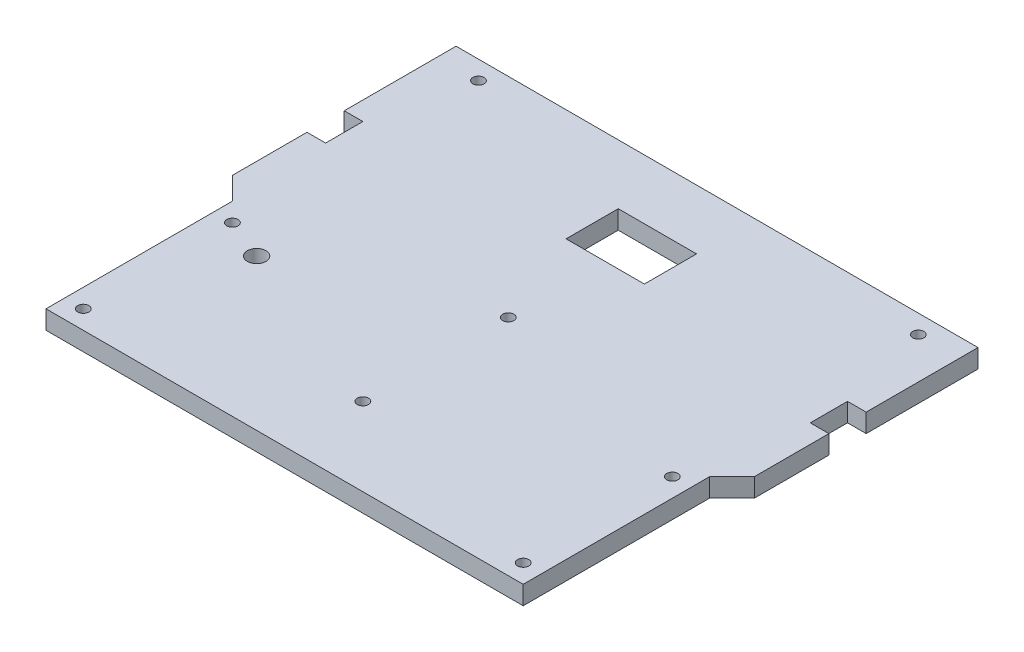
ISO-10303-21;
HEADER;
FILE_DESCRIPTION(('STEP AP214'),'2;1');
FILE_NAME('part.step','',(''),(''),'','','');
FILE_SCHEMA(('AUTOMOTIVE_DESIGN { 1 0 10303 214 1 1 1 1 }'));
ENDSEC;
DATA;
#1=APPLICATION_CONTEXT('core data for automotive mechanical design processes');
#2=APPLICATION_PROTOCOL_DEFINITION('international standard','automotive_design',2000,#1);
#3=PRODUCT_CONTEXT('',#1,'mechanical');
#4=PRODUCT('Part','Part','',(#3));
#5=PRODUCT_RELATED_PRODUCT_CATEGORY('part','',(#4));
#6=PRODUCT_DEFINITION_FORMATION('','',#4);
#7=PRODUCT_DEFINITION_CONTEXT('part definition',#1,'design');
#8=PRODUCT_DEFINITION('design','',#6,#7);
#9=PRODUCT_DEFINITION_SHAPE('','',#8);
#10=(LENGTH_UNIT() NAMED_UNIT(*) SI_UNIT(.MILLI.,.METRE.));
#11=(NAMED_UNIT(*) PLANE_ANGLE_UNIT() SI_UNIT($,.RADIAN.));
#12=(NAMED_UNIT(*) SI_UNIT($,.STERADIAN.) SOLID_ANGLE_UNIT());
#13=UNCERTAINTY_MEASURE_WITH_UNIT(LENGTH_MEASURE(1.E-05),#10,'distance_accuracy_value','');
#14=(GEOMETRIC_REPRESENTATION_CONTEXT(3) GLOBAL_UNCERTAINTY_ASSIGNED_CONTEXT((#13)) GLOBAL_UNIT_ASSIGNED_CONTEXT((#10,
#11,#12)) REPRESENTATION_CONTEXT('',''));
#15=CARTESIAN_POINT('',(0.,0.,0.));
#16=DIRECTION('',(0.,0.,1.));
#17=DIRECTION('',(1.,0.,0.));
#18=AXIS2_PLACEMENT_3D('',#15,#16,#17);
#19=CARTESIAN_POINT('',(0.,5.,0.));
#20=DIRECTION('',(0.,1.,0.));
#21=DIRECTION('',(0.,0.,1.));
#22=AXIS2_PLACEMENT_3D('',#19,#20,#21);
#23=PLANE('',#22);
#24=DIRECTION('',(-1.,0.,0.));
#25=VECTOR('',#24,1.);
#26=CARTESIAN_POINT('',(0.,5.,16.));
#27=LINE('',#26,#25);
#28=CARTESIAN_POINT('',(10.5,5.,16.));
#29=VERTEX_POINT('',#28);
#30=CARTESIAN_POINT('',(-10.5,5.,16.));
#31=VERTEX_POINT('',#30);
#32=EDGE_CURVE('E55',#29,#31,#27,.T.);
#33=ORIENTED_EDGE('',*,*,#32,.F.);
#34=DIRECTION('',(0.,0.,1.));
#35=VECTOR('',#34,1.);
#36=CARTESIAN_POINT('',(10.5,5.,0.));
#37=LINE('',#36,#35);
#38=CARTESIAN_POINT('',(10.5,5.,30.));
#39=VERTEX_POINT('',#38);
#40=EDGE_CURVE('E196',#29,#39,#37,.T.);
#41=ORIENTED_EDGE('',*,*,#40,.T.);
#42=DIRECTION('',(-1.,0.,0.));
#43=VECTOR('',#42,1.);
#44=CARTESIAN_POINT('',(0.,5.,30.));
#45=LINE('',#44,#43);
#46=CARTESIAN_POINT('',(-10.5,5.,30.));
#47=VERTEX_POINT('',#46);
#48=EDGE_CURVE('E200',#39,#47,#45,.T.);
#49=ORIENTED_EDGE('',*,*,#48,.T.);
#50=DIRECTION('',(0.,0.,1.));
#51=VECTOR('',#50,1.);
#52=CARTESIAN_POINT('',(-10.5,5.,0.));
#53=LINE('',#52,#51);
#54=EDGE_CURVE('E209',#31,#47,#53,.T.);
#55=ORIENTED_EDGE('',*,*,#54,.F.);
#56=EDGE_LOOP('',(#33,#41,#49,#55));
#57=FACE_BOUND('',#56,.T.);
#58=CARTESIAN_POINT('',(0.,5.,56.));
#59=DIRECTION('',(0.,1.,0.));
#60=DIRECTION('',(0.,0.,1.));
#61=AXIS2_PLACEMENT_3D('',#58,#59,#60);
#62=CIRCLE('',#61,1.5);
#63=CARTESIAN_POINT('',(0.,5.,57.5));
#64=VERTEX_POINT('',#63);
#65=EDGE_CURVE('E210',#64,#64,#62,.T.);
#66=ORIENTED_EDGE('',*,*,#65,.F.);
#67=EDGE_LOOP('',(#66));
#68=FACE_BOUND('',#67,.T.);
#69=CARTESIAN_POINT('',(0.,5.,95.));
#70=DIRECTION('',(0.,1.,0.));
#71=DIRECTION('',(0.,0.,1.));
#72=AXIS2_PLACEMENT_3D('',#69,#70,#71);
#73=CIRCLE('',#72,1.5);
#74=CARTESIAN_POINT('',(0.,5.,96.5));
#75=VERTEX_POINT('',#74);
#76=EDGE_CURVE('E232',#75,#75,#73,.T.);
#77=ORIENTED_EDGE('',*,*,#76,.F.);
#78=EDGE_LOOP('',(#77));
#79=FACE_BOUND('',#78,.T.);
#80=CARTESIAN_POINT('',(-48.,5.,75.5));
#81=DIRECTION('',(0.,1.,0.));
#82=DIRECTION('',(0.,0.,1.));
#83=AXIS2_PLACEMENT_3D('',#80,#81,#82);
#84=CIRCLE('',#83,2.5);
#85=CARTESIAN_POINT('',(-48.,5.,78.));
#86=VERTEX_POINT('',#85);
#87=EDGE_CURVE('E240',#86,#86,#84,.T.);
#88=ORIENTED_EDGE('',*,*,#87,.F.);
#89=EDGE_LOOP('',(#88));
#90=FACE_BOUND('',#89,.T.);
#91=CARTESIAN_POINT('',(-59.,5.,71.));
#92=DIRECTION('',(0.,1.,0.));
#93=DIRECTION('',(0.,0.,-1.));
#94=AXIS2_PLACEMENT_3D('',#91,#92,#93);
#95=CIRCLE('',#94,1.5);
#96=CARTESIAN_POINT('',(-59.,5.,69.5));
#97=VERTEX_POINT('',#96);
#98=EDGE_CURVE('E256',#97,#97,#95,.T.);
#99=ORIENTED_EDGE('',*,*,#98,.F.);
#100=EDGE_LOOP('',(#99));
#101=FACE_BOUND('',#100,.T.);
#102=CARTESIAN_POINT('',(59.,5.,5.));
#103=DIRECTION('',(0.,1.,0.));
#104=DIRECTION('',(0.,0.,1.));
#105=AXIS2_PLACEMENT_3D('',#102,#103,#104);
#106=CIRCLE('',#105,1.5);
#107=CARTESIAN_POINT('',(59.,5.,6.50000000000001));
#108=VERTEX_POINT('',#107);
#109=EDGE_CURVE('E272',#108,#108,#106,.T.);
#110=ORIENTED_EDGE('',*,*,#109,.F.);
#111=EDGE_LOOP('',(#110));
#112=FACE_BOUND('',#111,.T.);
#113=CARTESIAN_POINT('',(59.,5.,71.));
#114=DIRECTION('',(0.,1.,0.));
#115=DIRECTION('',(0.,0.,1.));
#116=AXIS2_PLACEMENT_3D('',#113,#114,#115);
#117=CIRCLE('',#116,1.5);
#118=CARTESIAN_POINT('',(59.,5.,72.5));
#119=VERTEX_POINT('',#118);
#120=EDGE_CURVE('E288',#119,#119,#117,.T.);
#121=ORIENTED_EDGE('',*,*,#120,.F.);
#122=EDGE_LOOP('',(#121));
#123=FACE_BOUND('',#122,.T.);
#124=DIRECTION('',(1.,0.,0.));
#125=VECTOR('',#124,1.);
#126=CARTESIAN_POINT('',(-64.,5.,116.));
#127=LINE('',#126,#125);
#128=CARTESIAN_POINT('',(-64.,5.,116.));
#129=VERTEX_POINT('',#128);
#130=CARTESIAN_POINT('',(64.,5.,116.));
#131=VERTEX_POINT('',#130);
#132=EDGE_CURVE('E296',#129,#131,#127,.T.);
#133=ORIENTED_EDGE('',*,*,#132,.T.);
#134=DIRECTION('',(0.,0.,-1.));
#135=VECTOR('',#134,1.);
#136=CARTESIAN_POINT('',(64.,5.,116.));
#137=LINE('',#136,#135);
#138=CARTESIAN_POINT('',(64.,5.,66.));
#139=VERTEX_POINT('',#138);
#140=EDGE_CURVE('E300',#131,#139,#137,.T.);
#141=ORIENTED_EDGE('',*,*,#140,.T.);
#142=DIRECTION('',(0.707106781186548,0.,-0.707106781186547));
#143=VECTOR('',#142,1.);
#144=CARTESIAN_POINT('',(64.,5.,66.));
#145=LINE('',#144,#143);
#146=CARTESIAN_POINT('',(70.,5.,60.));
#147=VERTEX_POINT('',#146);
#148=EDGE_CURVE('E304',#139,#147,#145,.T.);
#149=ORIENTED_EDGE('',*,*,#148,.T.);
#150=DIRECTION('',(0.,0.,-1.));
#151=VECTOR('',#150,1.);
#152=CARTESIAN_POINT('',(70.,5.,60.));
#153=LINE('',#152,#151);
#154=CARTESIAN_POINT('',(70.,5.,40.));
#155=VERTEX_POINT('',#154);
#156=EDGE_CURVE('E307',#147,#155,#153,.T.);
#157=ORIENTED_EDGE('',*,*,#156,.T.);
#158=DIRECTION('',(-1.,0.,0.));
#159=VECTOR('',#158,1.);
#160=CARTESIAN_POINT('',(70.,5.,40.));
#161=LINE('',#160,#159);
#162=CARTESIAN_POINT('',(65.,5.,40.));
#163=VERTEX_POINT('',#162);
#164=EDGE_CURVE('E310',#155,#163,#161,.T.);
#165=ORIENTED_EDGE('',*,*,#164,.T.);
#166=DIRECTION('',(0.,0.,-1.));
#167=VECTOR('',#166,1.);
#168=CARTESIAN_POINT('',(65.,5.,40.));
#169=LINE('',#168,#167);
#170=CARTESIAN_POINT('',(65.,5.,30.));
#171=VERTEX_POINT('',#170);
#172=EDGE_CURVE('E313',#163,#171,#169,.T.);
#173=ORIENTED_EDGE('',*,*,#172,.T.);
#174=DIRECTION('',(1.,0.,0.));
#175=VECTOR('',#174,1.);
#176=CARTESIAN_POINT('',(65.,5.,30.));
#177=LINE('',#176,#175);
#178=CARTESIAN_POINT('',(70.,5.,30.));
#179=VERTEX_POINT('',#178);
#180=EDGE_CURVE('E316',#171,#179,#177,.T.);
#181=ORIENTED_EDGE('',*,*,#180,.T.);
#182=DIRECTION('',(0.,0.,-1.));
#183=VECTOR('',#182,1.);
#184=CARTESIAN_POINT('',(70.,5.,30.));
#185=LINE('',#184,#183);
#186=CARTESIAN_POINT('',(70.,5.,0.));
#187=VERTEX_POINT('',#186);
#188=EDGE_CURVE('E319',#179,#187,#185,.T.);
#189=ORIENTED_EDGE('',*,*,#188,.T.);
#190=DIRECTION('',(-1.,0.,0.));
#191=VECTOR('',#190,1.);
#192=CARTESIAN_POINT('',(70.,5.,0.));
#193=LINE('',#192,#191);
#194=CARTESIAN_POINT('',(-70.,5.,0.));
#195=VERTEX_POINT('',#194);
#196=EDGE_CURVE('E322',#187,#195,#193,.T.);
#197=ORIENTED_EDGE('',*,*,#196,.T.);
#198=DIRECTION('',(0.,0.,1.));
#199=VECTOR('',#198,1.);
#200=CARTESIAN_POINT('',(-70.,5.,30.));
#201=LINE('',#200,#199);
#202=CARTESIAN_POINT('',(-70.,5.,30.));
#203=VERTEX_POINT('',#202);
#204=EDGE_CURVE('E325',#195,#203,#201,.T.);
#205=ORIENTED_EDGE('',*,*,#204,.T.);
#206=DIRECTION('',(1.,0.,0.));
#207=VECTOR('',#206,1.);
#208=CARTESIAN_POINT('',(-65.,5.,30.));
#209=LINE('',#208,#207);
#210=CARTESIAN_POINT('',(-65.,5.,30.));
#211=VERTEX_POINT('',#210);
#212=EDGE_CURVE('E328',#203,#211,#209,.T.);
#213=ORIENTED_EDGE('',*,*,#212,.T.);
#214=DIRECTION('',(0.,0.,1.));
#215=VECTOR('',#214,1.);
#216=CARTESIAN_POINT('',(-65.,5.,40.));
#217=LINE('',#216,#215);
#218=CARTESIAN_POINT('',(-65.,5.,40.));
#219=VERTEX_POINT('',#218);
#220=EDGE_CURVE('E331',#211,#219,#217,.T.);
#221=ORIENTED_EDGE('',*,*,#220,.T.);
#222=DIRECTION('',(-1.,0.,0.));
#223=VECTOR('',#222,1.);
#224=CARTESIAN_POINT('',(-70.,5.,40.));
#225=LINE('',#224,#223);
#226=CARTESIAN_POINT('',(-70.,5.,40.));
#227=VERTEX_POINT('',#226);
#228=EDGE_CURVE('E334',#219,#227,#225,.T.);
#229=ORIENTED_EDGE('',*,*,#228,.T.);
#230=DIRECTION('',(0.,0.,1.));
#231=VECTOR('',#230,1.);
#232=CARTESIAN_POINT('',(-70.,5.,60.));
#233=LINE('',#232,#231);
#234=CARTESIAN_POINT('',(-70.,5.,60.));
#235=VERTEX_POINT('',#234);
#236=EDGE_CURVE('E337',#227,#235,#233,.T.);
#237=ORIENTED_EDGE('',*,*,#236,.T.);
#238=DIRECTION('',(0.707106781186547,0.,0.707106781186547));
#239=VECTOR('',#238,1.);
#240=CARTESIAN_POINT('',(-64.,5.,66.));
#241=LINE('',#240,#239);
#242=CARTESIAN_POINT('',(-64.,5.,66.));
#243=VERTEX_POINT('',#242);
#244=EDGE_CURVE('E340',#235,#243,#241,.T.);
#245=ORIENTED_EDGE('',*,*,#244,.T.);
#246=DIRECTION('',(0.,0.,1.));
#247=VECTOR('',#246,1.);
#248=CARTESIAN_POINT('',(-64.,5.,116.));
#249=LINE('',#248,#247);
#250=EDGE_CURVE('E343',#243,#129,#249,.T.);
#251=ORIENTED_EDGE('',*,*,#250,.T.);
#252=EDGE_LOOP('',(#133,#141,#149,#157,#165,#173,#181,#189,#197,#205,#213,#221,#229,#237,#245,#251));
#253=FACE_BOUND('',#252,.T.);
#254=CARTESIAN_POINT('',(59.,5.,111.));
#255=DIRECTION('',(0.,1.,0.));
#256=DIRECTION('',(0.,0.,1.));
#257=AXIS2_PLACEMENT_3D('',#254,#255,#256);
#258=CIRCLE('',#257,1.5);
#259=CARTESIAN_POINT('',(59.,5.,112.5));
#260=VERTEX_POINT('',#259);
#261=EDGE_CURVE('E280',#260,#260,#258,.T.);
#262=ORIENTED_EDGE('',*,*,#261,.F.);
#263=EDGE_LOOP('',(#262));
#264=FACE_BOUND('',#263,.T.);
#265=CARTESIAN_POINT('',(-59.,5.,111.));
#266=DIRECTION('',(0.,1.,0.));
#267=DIRECTION('',(0.,0.,-1.));
#268=AXIS2_PLACEMENT_3D('',#265,#266,#267);
#269=CIRCLE('',#268,1.5);
#270=CARTESIAN_POINT('',(-59.,5.,109.5));
#271=VERTEX_POINT('',#270);
#272=EDGE_CURVE('E264',#271,#271,#269,.T.);
#273=ORIENTED_EDGE('',*,*,#272,.F.);
#274=EDGE_LOOP('',(#273));
#275=FACE_BOUND('',#274,.T.);
#276=CARTESIAN_POINT('',(-59.,5.,5.00000000000002));
#277=DIRECTION('',(0.,1.,0.));
#278=DIRECTION('',(0.,0.,-1.));
#279=AXIS2_PLACEMENT_3D('',#276,#277,#278);
#280=CIRCLE('',#279,1.5);
#281=CARTESIAN_POINT('',(-59.,5.,3.50000000000001));
#282=VERTEX_POINT('',#281);
#283=EDGE_CURVE('E248',#282,#282,#280,.T.);
#284=ORIENTED_EDGE('',*,*,#283,.F.);
#285=EDGE_LOOP('',(#284));
#286=FACE_BOUND('',#285,.T.);
#287=ADVANCED_FACE('F39',(#57,#68,#79,#90,#101,#112,#123,#253,#264,#275,#286),#23,.T.);
#288=CARTESIAN_POINT('',(0.,0.,0.));
#289=DIRECTION('',(0.,1.,0.));
#290=DIRECTION('',(0.,0.,1.));
#291=AXIS2_PLACEMENT_3D('',#288,#289,#290);
#292=PLANE('',#291);
#293=DIRECTION('',(0.,0.,1.));
#294=VECTOR('',#293,1.);
#295=CARTESIAN_POINT('',(10.5,0.,0.));
#296=LINE('',#295,#294);
#297=CARTESIAN_POINT('',(10.5,0.,16.));
#298=VERTEX_POINT('',#297);
#299=CARTESIAN_POINT('',(10.5,0.,30.));
#300=VERTEX_POINT('',#299);
#301=EDGE_CURVE('E183',#298,#300,#296,.T.);
#302=ORIENTED_EDGE('',*,*,#301,.F.);
#303=DIRECTION('',(-1.,0.,0.));
#304=VECTOR('',#303,1.);
#305=CARTESIAN_POINT('',(0.,0.,16.));
#306=LINE('',#305,#304);
#307=CARTESIAN_POINT('',(-10.5,0.,16.));
#308=VERTEX_POINT('',#307);
#309=EDGE_CURVE('E179',#298,#308,#306,.T.);
#310=ORIENTED_EDGE('',*,*,#309,.T.);
#311=DIRECTION('',(0.,0.,1.));
#312=VECTOR('',#311,1.);
#313=CARTESIAN_POINT('',(-10.5,0.,0.));
#314=LINE('',#313,#312);
#315=CARTESIAN_POINT('',(-10.5,0.,30.));
#316=VERTEX_POINT('',#315);
#317=EDGE_CURVE('E186',#308,#316,#314,.T.);
#318=ORIENTED_EDGE('',*,*,#317,.T.);
#319=DIRECTION('',(-1.,0.,0.));
#320=VECTOR('',#319,1.);
#321=CARTESIAN_POINT('',(0.,0.,30.));
#322=LINE('',#321,#320);
#323=EDGE_CURVE('E191',#300,#316,#322,.T.);
#324=ORIENTED_EDGE('',*,*,#323,.F.);
#325=EDGE_LOOP('',(#302,#310,#318,#324));
#326=FACE_BOUND('',#325,.T.);
#327=CARTESIAN_POINT('',(0.,0.,56.));
#328=DIRECTION('',(0.,1.,0.));
#329=DIRECTION('',(0.,0.,1.));
#330=AXIS2_PLACEMENT_3D('',#327,#328,#329);
#331=CIRCLE('',#330,1.5);
#332=CARTESIAN_POINT('',(0.,0.,57.5));
#333=VERTEX_POINT('',#332);
#334=EDGE_CURVE('E228',#333,#333,#331,.T.);
#335=ORIENTED_EDGE('',*,*,#334,.T.);
#336=EDGE_LOOP('',(#335));
#337=FACE_BOUND('',#336,.T.);
#338=CARTESIAN_POINT('',(0.,0.,95.));
#339=DIRECTION('',(0.,1.,0.));
#340=DIRECTION('',(0.,0.,1.));
#341=AXIS2_PLACEMENT_3D('',#338,#339,#340);
#342=CIRCLE('',#341,1.5);
#343=CARTESIAN_POINT('',(0.,0.,96.5));
#344=VERTEX_POINT('',#343);
#345=EDGE_CURVE('E236',#344,#344,#342,.T.);
#346=ORIENTED_EDGE('',*,*,#345,.T.);
#347=EDGE_LOOP('',(#346));
#348=FACE_BOUND('',#347,.T.);
#349=CARTESIAN_POINT('',(-48.,0.,75.5));
#350=DIRECTION('',(0.,1.,0.));
#351=DIRECTION('',(0.,0.,1.));
#352=AXIS2_PLACEMENT_3D('',#349,#350,#351);
#353=CIRCLE('',#352,2.5);
#354=CARTESIAN_POINT('',(-48.,0.,78.));
#355=VERTEX_POINT('',#354);
#356=EDGE_CURVE('E244',#355,#355,#353,.T.);
#357=ORIENTED_EDGE('',*,*,#356,.T.);
#358=EDGE_LOOP('',(#357));
#359=FACE_BOUND('',#358,.T.);
#360=DIRECTION('',(1.,0.,0.));
#361=VECTOR('',#360,1.);
#362=CARTESIAN_POINT('',(-64.,0.,116.));
#363=LINE('',#362,#361);
#364=CARTESIAN_POINT('',(-64.,0.,116.));
#365=VERTEX_POINT('',#364);
#366=CARTESIAN_POINT('',(64.,0.,116.));
#367=VERTEX_POINT('',#366);
#368=EDGE_CURVE('E292',#365,#367,#363,.T.);
#369=ORIENTED_EDGE('',*,*,#368,.F.);
#370=DIRECTION('',(0.,0.,1.));
#371=VECTOR('',#370,1.);
#372=CARTESIAN_POINT('',(-64.,0.,116.));
#373=LINE('',#372,#371);
#374=CARTESIAN_POINT('',(-64.,0.,66.));
#375=VERTEX_POINT('',#374);
#376=EDGE_CURVE('E301',#375,#365,#373,.T.);
#377=ORIENTED_EDGE('',*,*,#376,.F.);
#378=DIRECTION('',(0.707106781186547,0.,0.707106781186547));
#379=VECTOR('',#378,1.);
#380=CARTESIAN_POINT('',(-64.,0.,66.));
#381=LINE('',#380,#379);
#382=CARTESIAN_POINT('',(-70.,0.,60.));
#383=VERTEX_POINT('',#382);
#384=EDGE_CURVE('E389',#383,#375,#381,.T.);
#385=ORIENTED_EDGE('',*,*,#384,.F.);
#386=DIRECTION('',(0.,0.,1.));
#387=VECTOR('',#386,1.);
#388=CARTESIAN_POINT('',(-70.,0.,60.));
#389=LINE('',#388,#387);
#390=CARTESIAN_POINT('',(-70.,0.,40.));
#391=VERTEX_POINT('',#390);
#392=EDGE_CURVE('E386',#391,#383,#389,.T.);
#393=ORIENTED_EDGE('',*,*,#392,.F.);
#394=DIRECTION('',(-1.,0.,0.));
#395=VECTOR('',#394,1.);
#396=CARTESIAN_POINT('',(-70.,0.,40.));
#397=LINE('',#396,#395);
#398=CARTESIAN_POINT('',(-65.,0.,40.));
#399=VERTEX_POINT('',#398);
#400=EDGE_CURVE('E383',#399,#391,#397,.T.);
#401=ORIENTED_EDGE('',*,*,#400,.F.);
#402=DIRECTION('',(0.,0.,1.));
#403=VECTOR('',#402,1.);
#404=CARTESIAN_POINT('',(-65.,0.,40.));
#405=LINE('',#404,#403);
#406=CARTESIAN_POINT('',(-65.,0.,30.));
#407=VERTEX_POINT('',#406);
#408=EDGE_CURVE('E380',#407,#399,#405,.T.);
#409=ORIENTED_EDGE('',*,*,#408,.F.);
#410=DIRECTION('',(1.,0.,0.));
#411=VECTOR('',#410,1.);
#412=CARTESIAN_POINT('',(-65.,0.,30.));
#413=LINE('',#412,#411);
#414=CARTESIAN_POINT('',(-70.,0.,30.));
#415=VERTEX_POINT('',#414);
#416=EDGE_CURVE('E377',#415,#407,#413,.T.);
#417=ORIENTED_EDGE('',*,*,#416,.F.);
#418=DIRECTION('',(0.,0.,1.));
#419=VECTOR('',#418,1.);
#420=CARTESIAN_POINT('',(-70.,0.,30.));
#421=LINE('',#420,#419);
#422=CARTESIAN_POINT('',(-70.,0.,0.));
#423=VERTEX_POINT('',#422);
#424=EDGE_CURVE('E374',#423,#415,#421,.T.);
#425=ORIENTED_EDGE('',*,*,#424,.F.);
#426=DIRECTION('',(-1.,0.,0.));
#427=VECTOR('',#426,1.);
#428=CARTESIAN_POINT('',(70.,0.,0.));
#429=LINE('',#428,#427);
#430=CARTESIAN_POINT('',(70.,0.,0.));
#431=VERTEX_POINT('',#430);
#432=EDGE_CURVE('E371',#431,#423,#429,.T.);
#433=ORIENTED_EDGE('',*,*,#432,.F.);
#434=DIRECTION('',(0.,0.,-1.));
#435=VECTOR('',#434,1.);
#436=CARTESIAN_POINT('',(70.,0.,30.));
#437=LINE('',#436,#435);
#438=CARTESIAN_POINT('',(70.,0.,30.));
#439=VERTEX_POINT('',#438);
#440=EDGE_CURVE('E368',#439,#431,#437,.T.);
#441=ORIENTED_EDGE('',*,*,#440,.F.);
#442=DIRECTION('',(1.,0.,0.));
#443=VECTOR('',#442,1.);
#444=CARTESIAN_POINT('',(65.,0.,30.));
#445=LINE('',#444,#443);
#446=CARTESIAN_POINT('',(65.,0.,30.));
#447=VERTEX_POINT('',#446);
#448=EDGE_CURVE('E365',#447,#439,#445,.T.);
#449=ORIENTED_EDGE('',*,*,#448,.F.);
#450=DIRECTION('',(0.,0.,-1.));
#451=VECTOR('',#450,1.);
#452=CARTESIAN_POINT('',(65.,0.,40.));
#453=LINE('',#452,#451);
#454=CARTESIAN_POINT('',(65.,0.,40.));
#455=VERTEX_POINT('',#454);
#456=EDGE_CURVE('E362',#455,#447,#453,.T.);
#457=ORIENTED_EDGE('',*,*,#456,.F.);
#458=DIRECTION('',(-1.,0.,0.));
#459=VECTOR('',#458,1.);
#460=CARTESIAN_POINT('',(70.,0.,40.));
#461=LINE('',#460,#459);
#462=CARTESIAN_POINT('',(70.,0.,40.));
#463=VERTEX_POINT('',#462);
#464=EDGE_CURVE('E359',#463,#455,#461,.T.);
#465=ORIENTED_EDGE('',*,*,#464,.F.);
#466=DIRECTION('',(0.,0.,-1.));
#467=VECTOR('',#466,1.);
#468=CARTESIAN_POINT('',(70.,0.,60.));
#469=LINE('',#468,#467);
#470=CARTESIAN_POINT('',(70.,0.,60.));
#471=VERTEX_POINT('',#470);
#472=EDGE_CURVE('E356',#471,#463,#469,.T.);
#473=ORIENTED_EDGE('',*,*,#472,.F.);
#474=DIRECTION('',(0.707106781186548,0.,-0.707106781186547));
#475=VECTOR('',#474,1.);
#476=CARTESIAN_POINT('',(64.,0.,66.));
#477=LINE('',#476,#475);
#478=CARTESIAN_POINT('',(64.,0.,66.));
#479=VERTEX_POINT('',#478);
#480=EDGE_CURVE('E353',#479,#471,#477,.T.);
#481=ORIENTED_EDGE('',*,*,#480,.F.);
#482=DIRECTION('',(0.,0.,-1.));
#483=VECTOR('',#482,1.);
#484=CARTESIAN_POINT('',(64.,0.,116.));
#485=LINE('',#484,#483);
#486=EDGE_CURVE('E350',#367,#479,#485,.T.);
#487=ORIENTED_EDGE('',*,*,#486,.F.);
#488=EDGE_LOOP('',(#369,#377,#385,#393,#401,#409,#417,#425,#433,#441,#449,#457,#465,#473,#481,#487));
#489=FACE_BOUND('',#488,.T.);
#490=CARTESIAN_POINT('',(59.,0.,71.));
#491=DIRECTION('',(0.,1.,0.));
#492=DIRECTION('',(0.,0.,1.));
#493=AXIS2_PLACEMENT_3D('',#490,#491,#492);
#494=CIRCLE('',#493,1.5);
#495=CARTESIAN_POINT('',(59.,0.,72.5));
#496=VERTEX_POINT('',#495);
#497=EDGE_CURVE('E284',#496,#496,#494,.T.);
#498=ORIENTED_EDGE('',*,*,#497,.T.);
#499=EDGE_LOOP('',(#498));
#500=FACE_BOUND('',#499,.T.);
#501=CARTESIAN_POINT('',(59.,0.,111.));
#502=DIRECTION('',(0.,1.,0.));
#503=DIRECTION('',(0.,0.,1.));
#504=AXIS2_PLACEMENT_3D('',#501,#502,#503);
#505=CIRCLE('',#504,1.5);
#506=CARTESIAN_POINT('',(59.,0.,112.5));
#507=VERTEX_POINT('',#506);
#508=EDGE_CURVE('E276',#507,#507,#505,.T.);
#509=ORIENTED_EDGE('',*,*,#508,.T.);
#510=EDGE_LOOP('',(#509));
#511=FACE_BOUND('',#510,.T.);
#512=CARTESIAN_POINT('',(59.,0.,5.));
#513=DIRECTION('',(0.,1.,0.));
#514=DIRECTION('',(0.,0.,1.));
#515=AXIS2_PLACEMENT_3D('',#512,#513,#514);
#516=CIRCLE('',#515,1.5);
#517=CARTESIAN_POINT('',(59.,0.,6.50000000000001));
#518=VERTEX_POINT('',#517);
#519=EDGE_CURVE('E268',#518,#518,#516,.T.);
#520=ORIENTED_EDGE('',*,*,#519,.T.);
#521=EDGE_LOOP('',(#520));
#522=FACE_BOUND('',#521,.T.);
#523=CARTESIAN_POINT('',(-59.,0.,111.));
#524=DIRECTION('',(0.,1.,0.));
#525=DIRECTION('',(0.,0.,-1.));
#526=AXIS2_PLACEMENT_3D('',#523,#524,#525);
#527=CIRCLE('',#526,1.5);
#528=CARTESIAN_POINT('',(-59.,0.,109.5));
#529=VERTEX_POINT('',#528);
#530=EDGE_CURVE('E260',#529,#529,#527,.T.);
#531=ORIENTED_EDGE('',*,*,#530,.T.);
#532=EDGE_LOOP('',(#531));
#533=FACE_BOUND('',#532,.T.);
#534=CARTESIAN_POINT('',(-59.,0.,71.));
#535=DIRECTION('',(0.,1.,0.));
#536=DIRECTION('',(0.,0.,-1.));
#537=AXIS2_PLACEMENT_3D('',#534,#535,#536);
#538=CIRCLE('',#537,1.5);
#539=CARTESIAN_POINT('',(-59.,0.,69.5));
#540=VERTEX_POINT('',#539);
#541=EDGE_CURVE('E252',#540,#540,#538,.T.);
#542=ORIENTED_EDGE('',*,*,#541,.T.);
#543=EDGE_LOOP('',(#542));
#544=FACE_BOUND('',#543,.T.);
#545=CARTESIAN_POINT('',(-59.,0.,5.00000000000002));
#546=DIRECTION('',(0.,1.,0.));
#547=DIRECTION('',(0.,0.,-1.));
#548=AXIS2_PLACEMENT_3D('',#545,#546,#547);
#549=CIRCLE('',#548,1.5);
#550=CARTESIAN_POINT('',(-59.,0.,3.50000000000001));
#551=VERTEX_POINT('',#550);
#552=EDGE_CURVE('E219',#551,#551,#549,.T.);
#553=ORIENTED_EDGE('',*,*,#552,.T.);
#554=EDGE_LOOP('',(#553));
#555=FACE_BOUND('',#554,.T.);
#556=ADVANCED_FACE('F193',(#326,#337,#348,#359,#489,#500,#511,#522,#533,#544,#555),#292,.F.);
#557=CARTESIAN_POINT('',(-64.,5.,116.));
#558=DIRECTION('',(0.,0.,-1.));
#559=DIRECTION('',(-1.,0.,0.));
#560=AXIS2_PLACEMENT_3D('',#557,#558,#559);
#561=PLANE('',#560);
#562=ORIENTED_EDGE('',*,*,#368,.T.);
#563=DIRECTION('',(0.,-1.,0.));
#564=VECTOR('',#563,1.);
#565=CARTESIAN_POINT('',(64.,5.,116.));
#566=LINE('',#565,#564);
#567=EDGE_CURVE('E11',#131,#367,#566,.T.);
#568=ORIENTED_EDGE('',*,*,#567,.F.);
#569=ORIENTED_EDGE('',*,*,#132,.F.);
#570=DIRECTION('',(0.,-1.,0.));
#571=VECTOR('',#570,1.);
#572=CARTESIAN_POINT('',(-64.,5.,116.));
#573=LINE('',#572,#571);
#574=EDGE_CURVE('E346',#129,#365,#573,.T.);
#575=ORIENTED_EDGE('',*,*,#574,.T.);
#576=EDGE_LOOP('',(#562,#568,#569,#575));
#577=FACE_BOUND('',#576,.T.);
#578=ADVANCED_FACE('F41',(#577),#561,.F.);
#579=CARTESIAN_POINT('',(64.,5.,116.));
#580=DIRECTION('',(-1.,0.,0.));
#581=DIRECTION('',(0.,0.,1.));
#582=AXIS2_PLACEMENT_3D('',#579,#580,#581);
#583=PLANE('',#582);
#584=ORIENTED_EDGE('',*,*,#486,.T.);
#585=DIRECTION('',(0.,-1.,0.));
#586=VECTOR('',#585,1.);
#587=CARTESIAN_POINT('',(64.,5.,66.));
#588=LINE('',#587,#586);
#589=EDGE_CURVE('E48',#139,#479,#588,.T.);
#590=ORIENTED_EDGE('',*,*,#589,.F.);
#591=ORIENTED_EDGE('',*,*,#140,.F.);
#592=ORIENTED_EDGE('',*,*,#567,.T.);
#593=EDGE_LOOP('',(#584,#590,#591,#592));
#594=FACE_BOUND('',#593,.T.);
#595=ADVANCED_FACE('F477',(#594),#583,.F.);
#596=CARTESIAN_POINT('',(64.,5.,66.));
#597=DIRECTION('',(-0.707106781186547,0.,-0.707106781186548));
#598=DIRECTION('',(-0.707106781186548,0.,0.707106781186547));
#599=AXIS2_PLACEMENT_3D('',#596,#597,#598);
#600=PLANE('',#599);
#601=ORIENTED_EDGE('',*,*,#480,.T.);
#602=DIRECTION('',(0.,-1.,0.));
#603=VECTOR('',#602,1.);
#604=CARTESIAN_POINT('',(70.,5.,60.));
#605=LINE('',#604,#603);
#606=EDGE_CURVE('E445',#147,#471,#605,.T.);
#607=ORIENTED_EDGE('',*,*,#606,.F.);
#608=ORIENTED_EDGE('',*,*,#148,.F.);
#609=ORIENTED_EDGE('',*,*,#589,.T.);
#610=EDGE_LOOP('',(#601,#607,#608,#609));
#611=FACE_BOUND('',#610,.T.);
#612=ADVANCED_FACE('F454',(#611),#600,.F.);
#613=CARTESIAN_POINT('',(70.,5.,60.));
#614=DIRECTION('',(-1.,0.,0.));
#615=DIRECTION('',(0.,0.,1.));
#616=AXIS2_PLACEMENT_3D('',#613,#614,#615);
#617=PLANE('',#616);
#618=ORIENTED_EDGE('',*,*,#472,.T.);
#619=DIRECTION('',(0.,-1.,0.));
#620=VECTOR('',#619,1.);
#621=CARTESIAN_POINT('',(70.,5.,40.));
#622=LINE('',#621,#620);
#623=EDGE_CURVE('E441',#155,#463,#622,.T.);
#624=ORIENTED_EDGE('',*,*,#623,.F.);
#625=ORIENTED_EDGE('',*,*,#156,.F.);
#626=ORIENTED_EDGE('',*,*,#606,.T.);
#627=EDGE_LOOP('',(#618,#624,#625,#626));
#628=FACE_BOUND('',#627,.T.);
#629=ADVANCED_FACE('F465',(#628),#617,.F.);
#630=CARTESIAN_POINT('',(70.,5.,40.));
#631=DIRECTION('',(0.,0.,1.));
#632=DIRECTION('',(1.,0.,0.));
#633=AXIS2_PLACEMENT_3D('',#630,#631,#632);
#634=PLANE('',#633);
#635=ORIENTED_EDGE('',*,*,#464,.T.);
#636=DIRECTION('',(0.,-1.,0.));
#637=VECTOR('',#636,1.);
#638=CARTESIAN_POINT('',(65.,5.,40.));
#639=LINE('',#638,#637);
#640=EDGE_CURVE('E437',#163,#455,#639,.T.);
#641=ORIENTED_EDGE('',*,*,#640,.F.);
#642=ORIENTED_EDGE('',*,*,#164,.F.);
#643=ORIENTED_EDGE('',*,*,#623,.T.);
#644=EDGE_LOOP('',(#635,#641,#642,#643));
#645=FACE_BOUND('',#644,.T.);
#646=ADVANCED_FACE('F469',(#645),#634,.F.);
#647=CARTESIAN_POINT('',(65.,5.,40.));
#648=DIRECTION('',(-1.,0.,0.));
#649=DIRECTION('',(0.,0.,1.));
#650=AXIS2_PLACEMENT_3D('',#647,#648,#649);
#651=PLANE('',#650);
#652=ORIENTED_EDGE('',*,*,#456,.T.);
#653=DIRECTION('',(0.,-1.,0.));
#654=VECTOR('',#653,1.);
#655=CARTESIAN_POINT('',(65.,5.,30.));
#656=LINE('',#655,#654);
#657=EDGE_CURVE('E433',#171,#447,#656,.T.);
#658=ORIENTED_EDGE('',*,*,#657,.F.);
#659=ORIENTED_EDGE('',*,*,#172,.F.);
#660=ORIENTED_EDGE('',*,*,#640,.T.);
#661=EDGE_LOOP('',(#652,#658,#659,#660));
#662=FACE_BOUND('',#661,.T.);
#663=ADVANCED_FACE('F530',(#662),#651,.F.);
#664=CARTESIAN_POINT('',(65.,5.,30.));
#665=DIRECTION('',(0.,0.,-1.));
#666=DIRECTION('',(-1.,0.,0.));
#667=AXIS2_PLACEMENT_3D('',#664,#665,#666);
#668=PLANE('',#667);
#669=ORIENTED_EDGE('',*,*,#448,.T.);
#670=DIRECTION('',(0.,-1.,0.));
#671=VECTOR('',#670,1.);
#672=CARTESIAN_POINT('',(70.,5.,30.));
#673=LINE('',#672,#671);
#674=EDGE_CURVE('E429',#179,#439,#673,.T.);
#675=ORIENTED_EDGE('',*,*,#674,.F.);
#676=ORIENTED_EDGE('',*,*,#180,.F.);
#677=ORIENTED_EDGE('',*,*,#657,.T.);
#678=EDGE_LOOP('',(#669,#675,#676,#677));
#679=FACE_BOUND('',#678,.T.);
#680=ADVANCED_FACE('F527',(#679),#668,.F.);
#681=CARTESIAN_POINT('',(70.,5.,30.));
#682=DIRECTION('',(-1.,0.,0.));
#683=DIRECTION('',(0.,0.,1.));
#684=AXIS2_PLACEMENT_3D('',#681,#682,#683);
#685=PLANE('',#684);
#686=ORIENTED_EDGE('',*,*,#440,.T.);
#687=DIRECTION('',(0.,-1.,0.));
#688=VECTOR('',#687,1.);
#689=CARTESIAN_POINT('',(70.,5.,0.));
#690=LINE('',#689,#688);
#691=EDGE_CURVE('E425',#187,#431,#690,.T.);
#692=ORIENTED_EDGE('',*,*,#691,.F.);
#693=ORIENTED_EDGE('',*,*,#188,.F.);
#694=ORIENTED_EDGE('',*,*,#674,.T.);
#695=EDGE_LOOP('',(#686,#692,#693,#694));
#696=FACE_BOUND('',#695,.T.);
#697=ADVANCED_FACE('F523',(#696),#685,.F.);
#698=CARTESIAN_POINT('',(70.,5.,0.));
#699=DIRECTION('',(0.,0.,1.));
#700=DIRECTION('',(1.,0.,0.));
#701=AXIS2_PLACEMENT_3D('',#698,#699,#700);
#702=PLANE('',#701);
#703=ORIENTED_EDGE('',*,*,#432,.T.);
#704=DIRECTION('',(0.,-1.,0.));
#705=VECTOR('',#704,1.);
#706=CARTESIAN_POINT('',(-70.,5.,0.));
#707=LINE('',#706,#705);
#708=EDGE_CURVE('E421',#195,#423,#707,.T.);
#709=ORIENTED_EDGE('',*,*,#708,.F.);
#710=ORIENTED_EDGE('',*,*,#196,.F.);
#711=ORIENTED_EDGE('',*,*,#691,.T.);
#712=EDGE_LOOP('',(#703,#709,#710,#711));
#713=FACE_BOUND('',#712,.T.);
#714=ADVANCED_FACE('F519',(#713),#702,.F.);
#715=CARTESIAN_POINT('',(-70.,5.,30.));
#716=DIRECTION('',(1.,0.,0.));
#717=DIRECTION('',(0.,0.,-1.));
#718=AXIS2_PLACEMENT_3D('',#715,#716,#717);
#719=PLANE('',#718);
#720=ORIENTED_EDGE('',*,*,#424,.T.);
#721=DIRECTION('',(0.,-1.,0.));
#722=VECTOR('',#721,1.);
#723=CARTESIAN_POINT('',(-70.,5.,30.));
#724=LINE('',#723,#722);
#725=EDGE_CURVE('E417',#203,#415,#724,.T.);
#726=ORIENTED_EDGE('',*,*,#725,.F.);
#727=ORIENTED_EDGE('',*,*,#204,.F.);
#728=ORIENTED_EDGE('',*,*,#708,.T.);
#729=EDGE_LOOP('',(#720,#726,#727,#728));
#730=FACE_BOUND('',#729,.T.);
#731=ADVANCED_FACE('F514',(#730),#719,.F.);
#732=CARTESIAN_POINT('',(-65.,5.,30.));
#733=DIRECTION('',(0.,0.,-1.));
#734=DIRECTION('',(-1.,0.,0.));
#735=AXIS2_PLACEMENT_3D('',#732,#733,#734);
#736=PLANE('',#735);
#737=ORIENTED_EDGE('',*,*,#416,.T.);
#738=DIRECTION('',(0.,-1.,0.));
#739=VECTOR('',#738,1.);
#740=CARTESIAN_POINT('',(-65.,5.,30.));
#741=LINE('',#740,#739);
#742=EDGE_CURVE('E413',#211,#407,#741,.T.);
#743=ORIENTED_EDGE('',*,*,#742,.F.);
#744=ORIENTED_EDGE('',*,*,#212,.F.);
#745=ORIENTED_EDGE('',*,*,#725,.T.);
#746=EDGE_LOOP('',(#737,#743,#744,#745));
#747=FACE_BOUND('',#746,.T.);
#748=ADVANCED_FACE('F508',(#747),#736,.F.);
#749=CARTESIAN_POINT('',(-65.,5.,40.));
#750=DIRECTION('',(1.,0.,0.));
#751=DIRECTION('',(0.,0.,-1.));
#752=AXIS2_PLACEMENT_3D('',#749,#750,#751);
#753=PLANE('',#752);
#754=ORIENTED_EDGE('',*,*,#408,.T.);
#755=DIRECTION('',(0.,-1.,0.));
#756=VECTOR('',#755,1.);
#757=CARTESIAN_POINT('',(-65.,5.,40.));
#758=LINE('',#757,#756);
#759=EDGE_CURVE('E409',#219,#399,#758,.T.);
#760=ORIENTED_EDGE('',*,*,#759,.F.);
#761=ORIENTED_EDGE('',*,*,#220,.F.);
#762=ORIENTED_EDGE('',*,*,#742,.T.);
#763=EDGE_LOOP('',(#754,#760,#761,#762));
#764=FACE_BOUND('',#763,.T.);
#765=ADVANCED_FACE('F504',(#764),#753,.F.);
#766=CARTESIAN_POINT('',(-70.,5.,40.));
#767=DIRECTION('',(0.,0.,1.));
#768=DIRECTION('',(1.,0.,0.));
#769=AXIS2_PLACEMENT_3D('',#766,#767,#768);
#770=PLANE('',#769);
#771=ORIENTED_EDGE('',*,*,#400,.T.);
#772=DIRECTION('',(0.,-1.,0.));
#773=VECTOR('',#772,1.);
#774=CARTESIAN_POINT('',(-70.,5.,40.));
#775=LINE('',#774,#773);
#776=EDGE_CURVE('E405',#227,#391,#775,.T.);
#777=ORIENTED_EDGE('',*,*,#776,.F.);
#778=ORIENTED_EDGE('',*,*,#228,.F.);
#779=ORIENTED_EDGE('',*,*,#759,.T.);
#780=EDGE_LOOP('',(#771,#777,#778,#779));
#781=FACE_BOUND('',#780,.T.);
#782=ADVANCED_FACE('F499',(#781),#770,.F.);
#783=CARTESIAN_POINT('',(-70.,5.,60.));
#784=DIRECTION('',(1.,0.,0.));
#785=DIRECTION('',(0.,0.,-1.));
#786=AXIS2_PLACEMENT_3D('',#783,#784,#785);
#787=PLANE('',#786);
#788=ORIENTED_EDGE('',*,*,#392,.T.);
#789=DIRECTION('',(0.,-1.,0.));
#790=VECTOR('',#789,1.);
#791=CARTESIAN_POINT('',(-70.,5.,60.));
#792=LINE('',#791,#790);
#793=EDGE_CURVE('E401',#235,#383,#792,.T.);
#794=ORIENTED_EDGE('',*,*,#793,.F.);
#795=ORIENTED_EDGE('',*,*,#236,.F.);
#796=ORIENTED_EDGE('',*,*,#776,.T.);
#797=EDGE_LOOP('',(#788,#794,#795,#796));
#798=FACE_BOUND('',#797,.T.);
#799=ADVANCED_FACE('F493',(#798),#787,.F.);
#800=CARTESIAN_POINT('',(-64.,5.,66.));
#801=DIRECTION('',(0.707106781186548,0.,-0.707106781186548));
#802=DIRECTION('',(-0.707106781186548,0.,-0.707106781186548));
#803=AXIS2_PLACEMENT_3D('',#800,#801,#802);
#804=PLANE('',#803);
#805=ORIENTED_EDGE('',*,*,#384,.T.);
#806=DIRECTION('',(0.,-1.,0.));
#807=VECTOR('',#806,1.);
#808=CARTESIAN_POINT('',(-64.,5.,66.));
#809=LINE('',#808,#807);
#810=EDGE_CURVE('E397',#243,#375,#809,.T.);
#811=ORIENTED_EDGE('',*,*,#810,.F.);
#812=ORIENTED_EDGE('',*,*,#244,.F.);
#813=ORIENTED_EDGE('',*,*,#793,.T.);
#814=EDGE_LOOP('',(#805,#811,#812,#813));
#815=FACE_BOUND('',#814,.T.);
#816=ADVANCED_FACE('F489',(#815),#804,.F.);
#817=CARTESIAN_POINT('',(-64.,5.,116.));
#818=DIRECTION('',(1.,0.,0.));
#819=DIRECTION('',(0.,0.,-1.));
#820=AXIS2_PLACEMENT_3D('',#817,#818,#819);
#821=PLANE('',#820);
#822=ORIENTED_EDGE('',*,*,#376,.T.);
#823=ORIENTED_EDGE('',*,*,#574,.F.);
#824=ORIENTED_EDGE('',*,*,#250,.F.);
#825=ORIENTED_EDGE('',*,*,#810,.T.);
#826=EDGE_LOOP('',(#822,#823,#824,#825));
#827=FACE_BOUND('',#826,.T.);
#828=ADVANCED_FACE('F484',(#827),#821,.F.);
#829=CARTESIAN_POINT('',(59.,5.,71.));
#830=DIRECTION('',(0.,-1.,0.));
#831=DIRECTION('',(0.,0.,-1.));
#832=AXIS2_PLACEMENT_3D('',#829,#830,#831);
#833=CYLINDRICAL_SURFACE('',#832,1.5);
#834=ORIENTED_EDGE('',*,*,#120,.T.);
#835=EDGE_LOOP('',(#834));
#836=FACE_BOUND('',#835,.T.);
#837=ORIENTED_EDGE('',*,*,#497,.F.);
#838=EDGE_LOOP('',(#837));
#839=FACE_BOUND('',#838,.T.);
#840=ADVANCED_FACE('F548',(#836,#839),#833,.F.);
#841=CARTESIAN_POINT('',(59.,5.,111.));
#842=DIRECTION('',(0.,-1.,0.));
#843=DIRECTION('',(0.,0.,-1.));
#844=AXIS2_PLACEMENT_3D('',#841,#842,#843);
#845=CYLINDRICAL_SURFACE('',#844,1.5);
#846=ORIENTED_EDGE('',*,*,#261,.T.);
#847=EDGE_LOOP('',(#846));
#848=FACE_BOUND('',#847,.T.);
#849=ORIENTED_EDGE('',*,*,#508,.F.);
#850=EDGE_LOOP('',(#849));
#851=FACE_BOUND('',#850,.T.);
#852=ADVANCED_FACE('F610',(#848,#851),#845,.F.);
#853=CARTESIAN_POINT('',(59.,5.,5.));
#854=DIRECTION('',(0.,-1.,0.));
#855=DIRECTION('',(0.,0.,-1.));
#856=AXIS2_PLACEMENT_3D('',#853,#854,#855);
#857=CYLINDRICAL_SURFACE('',#856,1.5);
#858=ORIENTED_EDGE('',*,*,#109,.T.);
#859=EDGE_LOOP('',(#858));
#860=FACE_BOUND('',#859,.T.);
#861=ORIENTED_EDGE('',*,*,#519,.F.);
#862=EDGE_LOOP('',(#861));
#863=FACE_BOUND('',#862,.T.);
#864=ADVANCED_FACE('F617',(#860,#863),#857,.F.);
#865=CARTESIAN_POINT('',(-59.,5.,111.));
#866=DIRECTION('',(0.,-1.,0.));
#867=DIRECTION('',(0.,0.,-1.));
#868=AXIS2_PLACEMENT_3D('',#865,#866,#867);
#869=CYLINDRICAL_SURFACE('',#868,1.5);
#870=ORIENTED_EDGE('',*,*,#272,.T.);
#871=EDGE_LOOP('',(#870));
#872=FACE_BOUND('',#871,.T.);
#873=ORIENTED_EDGE('',*,*,#530,.F.);
#874=EDGE_LOOP('',(#873));
#875=FACE_BOUND('',#874,.T.);
#876=ADVANCED_FACE('F624',(#872,#875),#869,.F.);
#877=CARTESIAN_POINT('',(-59.,5.,71.));
#878=DIRECTION('',(0.,-1.,0.));
#879=DIRECTION('',(0.,0.,-1.));
#880=AXIS2_PLACEMENT_3D('',#877,#878,#879);
#881=CYLINDRICAL_SURFACE('',#880,1.5);
#882=ORIENTED_EDGE('',*,*,#98,.T.);
#883=EDGE_LOOP('',(#882));
#884=FACE_BOUND('',#883,.T.);
#885=ORIENTED_EDGE('',*,*,#541,.F.);
#886=EDGE_LOOP('',(#885));
#887=FACE_BOUND('',#886,.T.);
#888=ADVANCED_FACE('F632',(#884,#887),#881,.F.);
#889=CARTESIAN_POINT('',(-59.,5.,5.00000000000002));
#890=DIRECTION('',(0.,-1.,0.));
#891=DIRECTION('',(0.,0.,-1.));
#892=AXIS2_PLACEMENT_3D('',#889,#890,#891);
#893=CYLINDRICAL_SURFACE('',#892,1.5);
#894=ORIENTED_EDGE('',*,*,#283,.T.);
#895=EDGE_LOOP('',(#894));
#896=FACE_BOUND('',#895,.T.);
#897=ORIENTED_EDGE('',*,*,#552,.F.);
#898=EDGE_LOOP('',(#897));
#899=FACE_BOUND('',#898,.T.);
#900=ADVANCED_FACE('F640',(#896,#899),#893,.F.);
#901=CARTESIAN_POINT('',(-48.,0.,75.5));
#902=DIRECTION('',(0.,1.,0.));
#903=DIRECTION('',(0.,0.,1.));
#904=AXIS2_PLACEMENT_3D('',#901,#902,#903);
#905=CYLINDRICAL_SURFACE('',#904,2.5);
#906=ORIENTED_EDGE('',*,*,#356,.F.);
#907=EDGE_LOOP('',(#906));
#908=FACE_BOUND('',#907,.T.);
#909=ORIENTED_EDGE('',*,*,#87,.T.);
#910=EDGE_LOOP('',(#909));
#911=FACE_BOUND('',#910,.T.);
#912=ADVANCED_FACE('F648',(#908,#911),#905,.F.);
#913=CARTESIAN_POINT('',(0.,0.,95.));
#914=DIRECTION('',(0.,1.,0.));
#915=DIRECTION('',(0.,0.,1.));
#916=AXIS2_PLACEMENT_3D('',#913,#914,#915);
#917=CYLINDRICAL_SURFACE('',#916,1.5);
#918=ORIENTED_EDGE('',*,*,#345,.F.);
#919=EDGE_LOOP('',(#918));
#920=FACE_BOUND('',#919,.T.);
#921=ORIENTED_EDGE('',*,*,#76,.T.);
#922=EDGE_LOOP('',(#921));
#923=FACE_BOUND('',#922,.T.);
#924=ADVANCED_FACE('F656',(#920,#923),#917,.F.);
#925=CARTESIAN_POINT('',(0.,0.,56.));
#926=DIRECTION('',(0.,1.,0.));
#927=DIRECTION('',(0.,0.,1.));
#928=AXIS2_PLACEMENT_3D('',#925,#926,#927);
#929=CYLINDRICAL_SURFACE('',#928,1.5);
#930=ORIENTED_EDGE('',*,*,#334,.F.);
#931=EDGE_LOOP('',(#930));
#932=FACE_BOUND('',#931,.T.);
#933=ORIENTED_EDGE('',*,*,#65,.T.);
#934=EDGE_LOOP('',(#933));
#935=FACE_BOUND('',#934,.T.);
#936=ADVANCED_FACE('F665',(#932,#935),#929,.F.);
#937=CARTESIAN_POINT('',(0.,0.,16.));
#938=DIRECTION('',(0.,0.,-1.));
#939=DIRECTION('',(-1.,0.,0.));
#940=AXIS2_PLACEMENT_3D('',#937,#938,#939);
#941=PLANE('',#940);
#942=ORIENTED_EDGE('',*,*,#32,.T.);
#943=DIRECTION('',(0.,1.,0.));
#944=VECTOR('',#943,1.);
#945=CARTESIAN_POINT('',(-10.5,0.,16.));
#946=LINE('',#945,#944);
#947=EDGE_CURVE('E176',#308,#31,#946,.T.);
#948=ORIENTED_EDGE('',*,*,#947,.F.);
#949=ORIENTED_EDGE('',*,*,#309,.F.);
#950=DIRECTION('',(0.,1.,0.));
#951=VECTOR('',#950,1.);
#952=CARTESIAN_POINT('',(10.5,0.,16.));
#953=LINE('',#952,#951);
#954=EDGE_CURVE('E216',#298,#29,#953,.T.);
#955=ORIENTED_EDGE('',*,*,#954,.T.);
#956=EDGE_LOOP('',(#942,#948,#949,#955));
#957=FACE_BOUND('',#956,.T.);
#958=ADVANCED_FACE('F177',(#957),#941,.F.);
#959=CARTESIAN_POINT('',(10.5,0.,0.));
#960=DIRECTION('',(-1.,0.,0.));
#961=DIRECTION('',(0.,0.,1.));
#962=AXIS2_PLACEMENT_3D('',#959,#960,#961);
#963=PLANE('',#962);
#964=ORIENTED_EDGE('',*,*,#40,.F.);
#965=ORIENTED_EDGE('',*,*,#954,.F.);
#966=ORIENTED_EDGE('',*,*,#301,.T.);
#967=DIRECTION('',(0.,1.,0.));
#968=VECTOR('',#967,1.);
#969=CARTESIAN_POINT('',(10.5,0.,30.));
#970=LINE('',#969,#968);
#971=EDGE_CURVE('E220',#300,#39,#970,.T.);
#972=ORIENTED_EDGE('',*,*,#971,.T.);
#973=EDGE_LOOP('',(#964,#965,#966,#972));
#974=FACE_BOUND('',#973,.T.);
#975=ADVANCED_FACE('F680',(#974),#963,.T.);
#976=CARTESIAN_POINT('',(0.,0.,30.));
#977=DIRECTION('',(0.,0.,-1.));
#978=DIRECTION('',(-1.,0.,0.));
#979=AXIS2_PLACEMENT_3D('',#976,#977,#978);
#980=PLANE('',#979);
#981=ORIENTED_EDGE('',*,*,#48,.F.);
#982=ORIENTED_EDGE('',*,*,#971,.F.);
#983=ORIENTED_EDGE('',*,*,#323,.T.);
#984=DIRECTION('',(0.,1.,0.));
#985=VECTOR('',#984,1.);
#986=CARTESIAN_POINT('',(-10.5,0.,30.));
#987=LINE('',#986,#985);
#988=EDGE_CURVE('E63',#316,#47,#987,.T.);
#989=ORIENTED_EDGE('',*,*,#988,.T.);
#990=EDGE_LOOP('',(#981,#982,#983,#989));
#991=FACE_BOUND('',#990,.T.);
#992=ADVANCED_FACE('F687',(#991),#980,.T.);
#993=CARTESIAN_POINT('',(-10.5,0.,0.));
#994=DIRECTION('',(-1.,0.,0.));
#995=DIRECTION('',(0.,0.,1.));
#996=AXIS2_PLACEMENT_3D('',#993,#994,#995);
#997=PLANE('',#996);
#998=ORIENTED_EDGE('',*,*,#54,.T.);
#999=ORIENTED_EDGE('',*,*,#988,.F.);
#1000=ORIENTED_EDGE('',*,*,#317,.F.);
#1001=ORIENTED_EDGE('',*,*,#947,.T.);
#1002=EDGE_LOOP('',(#998,#999,#1000,#1001));
#1003=FACE_BOUND('',#1002,.T.);
#1004=ADVANCED_FACE('F187',(#1003),#997,.F.);
#1005=CLOSED_SHELL('',(#287,#556,#578,#595,#612,#629,#646,#663,#680,#697,#714,#731,#748,#765,
#782,#799,#816,#828,#840,#852,#864,#876,#888,#900,#912,#924,#936,#958,#975,#992,#1004));
#1006=MANIFOLD_SOLID_BREP('B2',#1005);
#1007=ADVANCED_BREP_SHAPE_REPRESENTATION('',(#18,#1006),#14);
#1008=SHAPE_DEFINITION_REPRESENTATION(#9,#1007);
ENDSEC;
END-ISO-10303-21;
